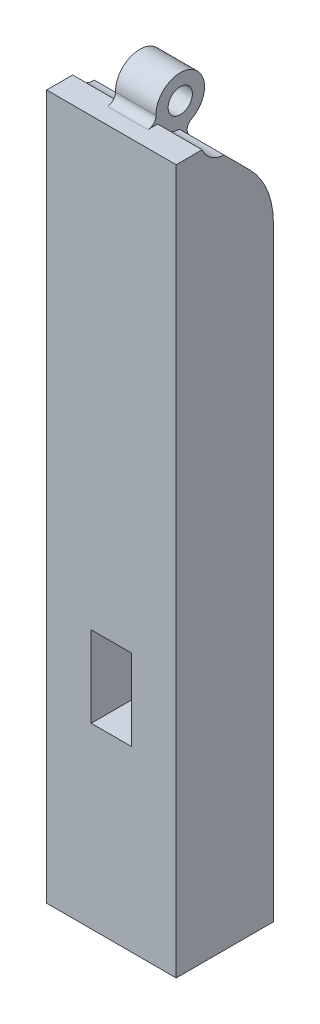
ISO-10303-21;
HEADER;
FILE_DESCRIPTION(('STEP AP214'),'2;1');
FILE_NAME('part.step','',(''),(''),'','','');
FILE_SCHEMA(('AUTOMOTIVE_DESIGN { 1 0 10303 214 1 1 1 1 }'));
ENDSEC;
DATA;
#1=APPLICATION_CONTEXT('core data for automotive mechanical design processes');
#2=APPLICATION_PROTOCOL_DEFINITION('international standard','automotive_design',2000,#1);
#3=PRODUCT_CONTEXT('',#1,'mechanical');
#4=PRODUCT('Part','Part','',(#3));
#5=PRODUCT_RELATED_PRODUCT_CATEGORY('part','',(#4));
#6=PRODUCT_DEFINITION_FORMATION('','',#4);
#7=PRODUCT_DEFINITION_CONTEXT('part definition',#1,'design');
#8=PRODUCT_DEFINITION('design','',#6,#7);
#9=PRODUCT_DEFINITION_SHAPE('','',#8);
#10=(LENGTH_UNIT() NAMED_UNIT(*) SI_UNIT(.MILLI.,.METRE.));
#11=(NAMED_UNIT(*) PLANE_ANGLE_UNIT() SI_UNIT($,.RADIAN.));
#12=(NAMED_UNIT(*) SI_UNIT($,.STERADIAN.) SOLID_ANGLE_UNIT());
#13=UNCERTAINTY_MEASURE_WITH_UNIT(LENGTH_MEASURE(1.E-05),#10,'distance_accuracy_value','');
#14=(GEOMETRIC_REPRESENTATION_CONTEXT(3) GLOBAL_UNCERTAINTY_ASSIGNED_CONTEXT((#13)) GLOBAL_UNIT_ASSIGNED_CONTEXT((#10,
#11,#12)) REPRESENTATION_CONTEXT('',''));
#15=CARTESIAN_POINT('',(0.,0.,0.));
#16=DIRECTION('',(0.,0.,1.));
#17=DIRECTION('',(1.,0.,0.));
#18=AXIS2_PLACEMENT_3D('',#15,#16,#17);
#19=CARTESIAN_POINT('',(0.,0.,0.));
#20=DIRECTION('',(0.,0.,1.));
#21=DIRECTION('',(1.,0.,0.));
#22=AXIS2_PLACEMENT_3D('',#19,#20,#21);
#23=PLANE('',#22);
#24=DIRECTION('',(0.,1.,0.));
#25=VECTOR('',#24,1.);
#26=CARTESIAN_POINT('',(-2.49999999999997,0.,0.));
#27=LINE('',#26,#25);
#28=CARTESIAN_POINT('',(-2.49999999999998,-21.0917859119298,0.));
#29=VERTEX_POINT('',#28);
#30=CARTESIAN_POINT('',(-2.49999999999997,-11.0917859119298,0.));
#31=VERTEX_POINT('',#30);
#32=EDGE_CURVE('E264',#29,#31,#27,.T.);
#33=ORIENTED_EDGE('',*,*,#32,.F.);
#34=DIRECTION('',(-1.,0.,0.));
#35=VECTOR('',#34,1.);
#36=CARTESIAN_POINT('',(0.,-21.0917859119298,0.));
#37=LINE('',#36,#35);
#38=CARTESIAN_POINT('',(2.50000000000002,-21.0917859119298,0.));
#39=VERTEX_POINT('',#38);
#40=EDGE_CURVE('E261',#39,#29,#37,.T.);
#41=ORIENTED_EDGE('',*,*,#40,.F.);
#42=DIRECTION('',(0.,1.,0.));
#43=VECTOR('',#42,1.);
#44=CARTESIAN_POINT('',(2.50000000000002,0.,0.));
#45=LINE('',#44,#43);
#46=CARTESIAN_POINT('',(2.50000000000002,-11.0917859119298,0.));
#47=VERTEX_POINT('',#46);
#48=EDGE_CURVE('E254',#39,#47,#45,.T.);
#49=ORIENTED_EDGE('',*,*,#48,.T.);
#50=DIRECTION('',(-1.,0.,0.));
#51=VECTOR('',#50,1.);
#52=CARTESIAN_POINT('',(0.,-11.0917859119298,0.));
#53=LINE('',#52,#51);
#54=EDGE_CURVE('E267',#47,#31,#53,.T.);
#55=ORIENTED_EDGE('',*,*,#54,.T.);
#56=EDGE_LOOP('',(#33,#41,#49,#55));
#57=FACE_BOUND('',#56,.T.);
#58=DIRECTION('',(0.,-1.,0.));
#59=VECTOR('',#58,1.);
#60=CARTESIAN_POINT('',(-8.,23.9082140880702,0.));
#61=LINE('',#60,#59);
#62=CARTESIAN_POINT('',(-8.,11.7660784643393,0.));
#63=VERTEX_POINT('',#62);
#64=CARTESIAN_POINT('',(-7.99999999999999,-63.0917859119298,0.));
#65=VERTEX_POINT('',#64);
#66=EDGE_CURVE('E343',#63,#65,#61,.T.);
#67=ORIENTED_EDGE('',*,*,#66,.F.);
#68=DIRECTION('',(1.,0.,0.));
#69=VECTOR('',#68,1.);
#70=CARTESIAN_POINT('',(0.,11.7660784643393,0.));
#71=LINE('',#70,#69);
#72=CARTESIAN_POINT('',(8.,11.7660784643393,0.));
#73=VERTEX_POINT('',#72);
#74=EDGE_CURVE('E427',#63,#73,#71,.T.);
#75=ORIENTED_EDGE('',*,*,#74,.T.);
#76=DIRECTION('',(0.,1.,0.));
#77=VECTOR('',#76,1.);
#78=CARTESIAN_POINT('',(8.,23.9082140880702,0.));
#79=LINE('',#78,#77);
#80=CARTESIAN_POINT('',(8.00000000000002,-63.0917859119298,0.));
#81=VERTEX_POINT('',#80);
#82=EDGE_CURVE('E349',#81,#73,#79,.T.);
#83=ORIENTED_EDGE('',*,*,#82,.F.);
#84=DIRECTION('',(1.,0.,0.));
#85=VECTOR('',#84,1.);
#86=CARTESIAN_POINT('',(-7.99999999999999,-63.0917859119298,0.));
#87=LINE('',#86,#85);
#88=EDGE_CURVE('E361',#65,#81,#87,.T.);
#89=ORIENTED_EDGE('',*,*,#88,.F.);
#90=EDGE_LOOP('',(#67,#75,#83,#89));
#91=FACE_BOUND('',#90,.T.);
#92=DIRECTION('',(0.,-1.,0.));
#93=VECTOR('',#92,1.);
#94=CARTESIAN_POINT('',(-2.49999999999997,0.,0.));
#95=LINE('',#94,#93);
#96=CARTESIAN_POINT('',(-2.49999999999998,-31.0917859119298,0.));
#97=VERTEX_POINT('',#96);
#98=CARTESIAN_POINT('',(-2.49999999999998,-41.0917859119298,0.));
#99=VERTEX_POINT('',#98);
#100=EDGE_CURVE('E243',#97,#99,#95,.T.);
#101=ORIENTED_EDGE('',*,*,#100,.T.);
#102=DIRECTION('',(-1.,0.,0.));
#103=VECTOR('',#102,1.);
#104=CARTESIAN_POINT('',(0.,-41.0917859119298,0.));
#105=LINE('',#104,#103);
#106=CARTESIAN_POINT('',(2.50000000000002,-41.0917859119298,0.));
#107=VERTEX_POINT('',#106);
#108=EDGE_CURVE('E295',#107,#99,#105,.T.);
#109=ORIENTED_EDGE('',*,*,#108,.F.);
#110=DIRECTION('',(0.,-1.,0.));
#111=VECTOR('',#110,1.);
#112=CARTESIAN_POINT('',(2.50000000000002,0.,0.));
#113=LINE('',#112,#111);
#114=CARTESIAN_POINT('',(2.50000000000002,-31.0917859119298,0.));
#115=VERTEX_POINT('',#114);
#116=EDGE_CURVE('E202',#115,#107,#113,.T.);
#117=ORIENTED_EDGE('',*,*,#116,.F.);
#118=DIRECTION('',(-1.,0.,0.));
#119=VECTOR('',#118,1.);
#120=CARTESIAN_POINT('',(0.,-31.0917859119298,0.));
#121=LINE('',#120,#119);
#122=EDGE_CURVE('E289',#115,#97,#121,.T.);
#123=ORIENTED_EDGE('',*,*,#122,.T.);
#124=EDGE_LOOP('',(#101,#109,#117,#123));
#125=FACE_BOUND('',#124,.T.);
#126=ADVANCED_FACE('F38',(#57,#91,#125),#23,.F.);
#127=CARTESIAN_POINT('',(-8.,25.0082140880702,6.));
#128=DIRECTION('',(1.,0.,0.));
#129=DIRECTION('',(0.,0.,-1.));
#130=AXIS2_PLACEMENT_3D('',#127,#128,#129);
#131=CYLINDRICAL_SURFACE('',#130,3.);
#132=CARTESIAN_POINT('',(-2.5,25.0082140880702,6.));
#133=DIRECTION('',(1.,0.,0.));
#134=DIRECTION('',(0.,0.,-1.));
#135=AXIS2_PLACEMENT_3D('',#132,#133,#134);
#136=CIRCLE('',#135,3.);
#137=CARTESIAN_POINT('',(-2.5,23.9082140880702,8.79105714739057));
#138=VERTEX_POINT('',#137);
#139=CARTESIAN_POINT('',(-2.5,22.0099392522742,6.10172516420398));
#140=VERTEX_POINT('',#139);
#141=EDGE_CURVE('E319',#138,#140,#136,.T.);
#142=ORIENTED_EDGE('',*,*,#141,.T.);
#143=DIRECTION('',(1.,0.,0.));
#144=VECTOR('',#143,1.);
#145=CARTESIAN_POINT('',(-8.,22.0099392522742,6.10172516420398));
#146=LINE('',#145,#144);
#147=CARTESIAN_POINT('',(-8.,22.0099392522742,6.10172516420398));
#148=VERTEX_POINT('',#147);
#149=EDGE_CURVE('E383',#148,#140,#146,.T.);
#150=ORIENTED_EDGE('',*,*,#149,.F.);
#151=CARTESIAN_POINT('',(-8.,25.0082140880702,6.));
#152=DIRECTION('',(1.,0.,0.));
#153=DIRECTION('',(0.,0.,-1.));
#154=AXIS2_PLACEMENT_3D('',#151,#152,#153);
#155=CIRCLE('',#154,3.);
#156=CARTESIAN_POINT('',(-8.,23.9082140880702,8.79105714739057));
#157=VERTEX_POINT('',#156);
#158=EDGE_CURVE('E326',#157,#148,#155,.T.);
#159=ORIENTED_EDGE('',*,*,#158,.F.);
#160=DIRECTION('',(1.,0.,0.));
#161=VECTOR('',#160,1.);
#162=CARTESIAN_POINT('',(-8.,23.9082140880702,8.79105714739057));
#163=LINE('',#162,#161);
#164=EDGE_CURVE('E330',#138,#157,#163,.F.);
#165=ORIENTED_EDGE('',*,*,#164,.F.);
#166=EDGE_LOOP('',(#142,#150,#159,#165));
#167=FACE_BOUND('',#166,.T.);
#168=ADVANCED_FACE('F468',(#167),#131,.F.);
#169=CARTESIAN_POINT('',(-8.,23.9082140880702,12.));
#170=DIRECTION('',(1.,0.,0.));
#171=DIRECTION('',(0.,1.,0.));
#172=AXIS2_PLACEMENT_3D('',#169,#170,#171);
#173=PLANE('',#172);
#174=DIRECTION('',(0.,-0.707106781186547,-0.707106781186548));
#175=VECTOR('',#174,1.);
#176=CARTESIAN_POINT('',(-8.,7.95410704403511,-7.9541070440351));
#177=LINE('',#176,#175);
#178=CARTESIAN_POINT('',(-8.,18.8371462762047,2.92893218813453));
#179=VERTEX_POINT('',#178);
#180=EDGE_CURVE('E339',#148,#179,#177,.T.);
#181=ORIENTED_EDGE('',*,*,#180,.T.);
#182=CARTESIAN_POINT('',(-8.,11.7660784643393,10.));
#183=DIRECTION('',(1.,0.,0.));
#184=DIRECTION('',(0.,1.,0.));
#185=AXIS2_PLACEMENT_3D('',#182,#183,#184);
#186=CIRCLE('',#185,10.);
#187=EDGE_CURVE('E11',#179,#63,#186,.F.);
#188=ORIENTED_EDGE('',*,*,#187,.T.);
#189=ORIENTED_EDGE('',*,*,#66,.T.);
#190=DIRECTION('',(0.,0.,-1.));
#191=VECTOR('',#190,1.);
#192=CARTESIAN_POINT('',(-7.99999999999999,-63.0917859119298,12.));
#193=LINE('',#192,#191);
#194=CARTESIAN_POINT('',(-7.99999999999999,-63.0917859119298,12.));
#195=VERTEX_POINT('',#194);
#196=EDGE_CURVE('E378',#195,#65,#193,.T.);
#197=ORIENTED_EDGE('',*,*,#196,.F.);
#198=DIRECTION('',(0.,-1.,0.));
#199=VECTOR('',#198,1.);
#200=CARTESIAN_POINT('',(-8.,23.9082140880702,12.));
#201=LINE('',#200,#199);
#202=CARTESIAN_POINT('',(-8.,23.9082140880702,12.));
#203=VERTEX_POINT('',#202);
#204=EDGE_CURVE('E344',#203,#195,#201,.T.);
#205=ORIENTED_EDGE('',*,*,#204,.F.);
#206=DIRECTION('',(0.,0.,-1.));
#207=VECTOR('',#206,1.);
#208=CARTESIAN_POINT('',(-8.,23.9082140880702,12.));
#209=LINE('',#208,#207);
#210=EDGE_CURVE('E358',#203,#157,#209,.T.);
#211=ORIENTED_EDGE('',*,*,#210,.T.);
#212=ORIENTED_EDGE('',*,*,#158,.T.);
#213=EDGE_LOOP('',(#181,#188,#189,#197,#205,#211,#212));
#214=FACE_BOUND('',#213,.T.);
#215=ADVANCED_FACE('F442',(#214),#173,.F.);
#216=CARTESIAN_POINT('',(-7.99999999999999,-63.0917859119298,12.));
#217=DIRECTION('',(0.,1.,0.));
#218=DIRECTION('',(0.,0.,1.));
#219=AXIS2_PLACEMENT_3D('',#216,#217,#218);
#220=PLANE('',#219);
#221=ORIENTED_EDGE('',*,*,#88,.T.);
#222=DIRECTION('',(0.,0.,-1.));
#223=VECTOR('',#222,1.);
#224=CARTESIAN_POINT('',(8.00000000000002,-63.0917859119298,12.));
#225=LINE('',#224,#223);
#226=CARTESIAN_POINT('',(8.00000000000002,-63.0917859119298,12.));
#227=VERTEX_POINT('',#226);
#228=EDGE_CURVE('E374',#227,#81,#225,.T.);
#229=ORIENTED_EDGE('',*,*,#228,.F.);
#230=DIRECTION('',(1.,0.,0.));
#231=VECTOR('',#230,1.);
#232=CARTESIAN_POINT('',(-7.99999999999999,-63.0917859119298,12.));
#233=LINE('',#232,#231);
#234=EDGE_CURVE('E348',#195,#227,#233,.T.);
#235=ORIENTED_EDGE('',*,*,#234,.F.);
#236=ORIENTED_EDGE('',*,*,#196,.T.);
#237=EDGE_LOOP('',(#221,#229,#235,#236));
#238=FACE_BOUND('',#237,.T.);
#239=ADVANCED_FACE('F456',(#238),#220,.F.);
#240=CARTESIAN_POINT('',(8.,23.9082140880702,12.));
#241=DIRECTION('',(-1.,0.,0.));
#242=DIRECTION('',(0.,-1.,0.));
#243=AXIS2_PLACEMENT_3D('',#240,#241,#242);
#244=PLANE('',#243);
#245=ORIENTED_EDGE('',*,*,#82,.T.);
#246=CARTESIAN_POINT('',(8.,11.7660784643393,10.));
#247=DIRECTION('',(-1.,0.,0.));
#248=DIRECTION('',(0.,-1.,0.));
#249=AXIS2_PLACEMENT_3D('',#246,#247,#248);
#250=CIRCLE('',#249,10.);
#251=CARTESIAN_POINT('',(8.00000000000002,18.8371462762047,2.92893218813453));
#252=VERTEX_POINT('',#251);
#253=EDGE_CURVE('E431',#73,#252,#250,.F.);
#254=ORIENTED_EDGE('',*,*,#253,.T.);
#255=DIRECTION('',(0.,-0.707106781186547,-0.707106781186548));
#256=VECTOR('',#255,1.);
#257=CARTESIAN_POINT('',(8.00000000000002,7.95410704403511,-7.9541070440351));
#258=LINE('',#257,#256);
#259=CARTESIAN_POINT('',(8.00000000000002,22.0099392522742,6.10172516420398));
#260=VERTEX_POINT('',#259);
#261=EDGE_CURVE('E335',#260,#252,#258,.T.);
#262=ORIENTED_EDGE('',*,*,#261,.F.);
#263=CARTESIAN_POINT('',(8.00000000000002,25.0082140880702,6.));
#264=DIRECTION('',(1.,0.,0.));
#265=DIRECTION('',(0.,0.,-1.));
#266=AXIS2_PLACEMENT_3D('',#263,#264,#265);
#267=CIRCLE('',#266,3.);
#268=CARTESIAN_POINT('',(8.00000000000002,23.9082140880702,8.79105714739057));
#269=VERTEX_POINT('',#268);
#270=EDGE_CURVE('E317',#269,#260,#267,.T.);
#271=ORIENTED_EDGE('',*,*,#270,.F.);
#272=DIRECTION('',(0.,0.,-1.));
#273=VECTOR('',#272,1.);
#274=CARTESIAN_POINT('',(8.,23.9082140880702,12.));
#275=LINE('',#274,#273);
#276=CARTESIAN_POINT('',(8.,23.9082140880702,12.));
#277=VERTEX_POINT('',#276);
#278=EDGE_CURVE('E370',#277,#269,#275,.T.);
#279=ORIENTED_EDGE('',*,*,#278,.F.);
#280=DIRECTION('',(0.,1.,0.));
#281=VECTOR('',#280,1.);
#282=CARTESIAN_POINT('',(8.,23.9082140880702,12.));
#283=LINE('',#282,#281);
#284=EDGE_CURVE('E352',#227,#277,#283,.T.);
#285=ORIENTED_EDGE('',*,*,#284,.F.);
#286=ORIENTED_EDGE('',*,*,#228,.T.);
#287=EDGE_LOOP('',(#245,#254,#262,#271,#279,#285,#286));
#288=FACE_BOUND('',#287,.T.);
#289=ADVANCED_FACE('F451',(#288),#244,.F.);
#290=CARTESIAN_POINT('',(-8.,23.9082140880702,12.));
#291=DIRECTION('',(0.,-1.,0.));
#292=DIRECTION('',(1.,0.,0.));
#293=AXIS2_PLACEMENT_3D('',#290,#291,#292);
#294=PLANE('',#293);
#295=DIRECTION('',(1.,0.,0.));
#296=VECTOR('',#295,1.);
#297=CARTESIAN_POINT('',(-2.5,23.9082140880702,9.99874980462644));
#298=LINE('',#297,#296);
#299=CARTESIAN_POINT('',(2.5,23.9082140880702,9.99874980462644));
#300=VERTEX_POINT('',#299);
#301=CARTESIAN_POINT('',(-2.5,23.9082140880702,9.99874980462644));
#302=VERTEX_POINT('',#301);
#303=EDGE_CURVE('E391',#300,#302,#298,.F.);
#304=ORIENTED_EDGE('',*,*,#303,.T.);
#305=DIRECTION('',(0.,0.,-1.));
#306=VECTOR('',#305,1.);
#307=CARTESIAN_POINT('',(-2.5,23.9082140880702,6.));
#308=LINE('',#307,#306);
#309=EDGE_CURVE('E395',#302,#138,#308,.T.);
#310=ORIENTED_EDGE('',*,*,#309,.T.);
#311=ORIENTED_EDGE('',*,*,#164,.T.);
#312=ORIENTED_EDGE('',*,*,#210,.F.);
#313=DIRECTION('',(-1.,0.,0.));
#314=VECTOR('',#313,1.);
#315=CARTESIAN_POINT('',(-8.,23.9082140880702,12.));
#316=LINE('',#315,#314);
#317=EDGE_CURVE('E355',#277,#203,#316,.T.);
#318=ORIENTED_EDGE('',*,*,#317,.F.);
#319=ORIENTED_EDGE('',*,*,#278,.T.);
#320=CARTESIAN_POINT('',(2.5,23.9082140880702,8.79105714739057));
#321=VERTEX_POINT('',#320);
#322=EDGE_CURVE('E331',#269,#321,#163,.F.);
#323=ORIENTED_EDGE('',*,*,#322,.T.);
#324=DIRECTION('',(0.,0.,1.));
#325=VECTOR('',#324,1.);
#326=CARTESIAN_POINT('',(2.5,23.9082140880702,12.));
#327=LINE('',#326,#325);
#328=EDGE_CURVE('E387',#321,#300,#327,.T.);
#329=ORIENTED_EDGE('',*,*,#328,.T.);
#330=EDGE_LOOP('',(#304,#310,#311,#312,#318,#319,#323,#329));
#331=FACE_BOUND('',#330,.T.);
#332=ADVANCED_FACE('F462',(#331),#294,.F.);
#333=CARTESIAN_POINT('',(0.,0.,12.));
#334=DIRECTION('',(0.,0.,1.));
#335=DIRECTION('',(1.,0.,0.));
#336=AXIS2_PLACEMENT_3D('',#333,#334,#335);
#337=PLANE('',#336);
#338=DIRECTION('',(0.,-1.,0.));
#339=VECTOR('',#338,1.);
#340=CARTESIAN_POINT('',(2.50000000000002,-31.0917859119298,12.));
#341=LINE('',#340,#339);
#342=CARTESIAN_POINT('',(2.50000000000002,-31.0917859119298,12.));
#343=VERTEX_POINT('',#342);
#344=CARTESIAN_POINT('',(2.50000000000002,-41.0917859119298,12.));
#345=VERTEX_POINT('',#344);
#346=EDGE_CURVE('E199',#343,#345,#341,.T.);
#347=ORIENTED_EDGE('',*,*,#346,.T.);
#348=DIRECTION('',(-1.,0.,0.));
#349=VECTOR('',#348,1.);
#350=CARTESIAN_POINT('',(2.50000000000002,-41.0917859119298,12.));
#351=LINE('',#350,#349);
#352=CARTESIAN_POINT('',(-2.49999999999998,-41.0917859119298,12.));
#353=VERTEX_POINT('',#352);
#354=EDGE_CURVE('E208',#345,#353,#351,.T.);
#355=ORIENTED_EDGE('',*,*,#354,.T.);
#356=DIRECTION('',(0.,1.,0.));
#357=VECTOR('',#356,1.);
#358=CARTESIAN_POINT('',(-2.49999999999998,-31.0917859119298,12.));
#359=LINE('',#358,#357);
#360=CARTESIAN_POINT('',(-2.49999999999998,-31.0917859119298,12.));
#361=VERTEX_POINT('',#360);
#362=EDGE_CURVE('E213',#353,#361,#359,.T.);
#363=ORIENTED_EDGE('',*,*,#362,.T.);
#364=DIRECTION('',(1.,0.,0.));
#365=VECTOR('',#364,1.);
#366=CARTESIAN_POINT('',(2.50000000000002,-31.0917859119298,12.));
#367=LINE('',#366,#365);
#368=EDGE_CURVE('E218',#361,#343,#367,.T.);
#369=ORIENTED_EDGE('',*,*,#368,.T.);
#370=EDGE_LOOP('',(#347,#355,#363,#369));
#371=FACE_BOUND('',#370,.T.);
#372=ORIENTED_EDGE('',*,*,#204,.T.);
#373=ORIENTED_EDGE('',*,*,#234,.T.);
#374=ORIENTED_EDGE('',*,*,#284,.T.);
#375=ORIENTED_EDGE('',*,*,#317,.T.);
#376=EDGE_LOOP('',(#372,#373,#374,#375));
#377=FACE_BOUND('',#376,.T.);
#378=ADVANCED_FACE('F215',(#371,#377),#337,.T.);
#379=CARTESIAN_POINT('',(-8.,7.95410704403511,-7.9541070440351));
#380=DIRECTION('',(0.,-0.707106781186548,0.707106781186547));
#381=DIRECTION('',(0.,-0.707106781186547,-0.707106781186548));
#382=AXIS2_PLACEMENT_3D('',#379,#380,#381);
#383=PLANE('',#382);
#384=ORIENTED_EDGE('',*,*,#261,.T.);
#385=DIRECTION('',(1.,0.,0.));
#386=VECTOR('',#385,1.);
#387=CARTESIAN_POINT('',(-8.,18.8371462762047,2.92893218813453));
#388=LINE('',#387,#386);
#389=EDGE_CURVE('E47',#252,#179,#388,.F.);
#390=ORIENTED_EDGE('',*,*,#389,.T.);
#391=ORIENTED_EDGE('',*,*,#180,.F.);
#392=ORIENTED_EDGE('',*,*,#149,.T.);
#393=DIRECTION('',(0.,-0.707106781186547,-0.707106781186548));
#394=VECTOR('',#393,1.);
#395=CARTESIAN_POINT('',(-2.5,23.4582140880702,7.55));
#396=LINE('',#395,#394);
#397=CARTESIAN_POINT('',(-2.5,20.7583009373044,4.85008684923416));
#398=VERTEX_POINT('',#397);
#399=EDGE_CURVE('E404',#140,#398,#396,.T.);
#400=ORIENTED_EDGE('',*,*,#399,.T.);
#401=DIRECTION('',(1.,0.,0.));
#402=VECTOR('',#401,1.);
#403=CARTESIAN_POINT('',(2.5,20.7583009373044,4.85008684923417));
#404=LINE('',#403,#402);
#405=CARTESIAN_POINT('',(2.5,20.7583009373044,4.85008684923416));
#406=VERTEX_POINT('',#405);
#407=EDGE_CURVE('E408',#398,#406,#404,.T.);
#408=ORIENTED_EDGE('',*,*,#407,.T.);
#409=DIRECTION('',(0.,0.707106781186547,0.707106781186548));
#410=VECTOR('',#409,1.);
#411=CARTESIAN_POINT('',(2.5,7.95410704403511,-7.9541070440351));
#412=LINE('',#411,#410);
#413=CARTESIAN_POINT('',(2.5,22.0099392522742,6.10172516420398));
#414=VERTEX_POINT('',#413);
#415=EDGE_CURVE('E412',#406,#414,#412,.T.);
#416=ORIENTED_EDGE('',*,*,#415,.T.);
#417=EDGE_CURVE('E382',#414,#260,#146,.T.);
#418=ORIENTED_EDGE('',*,*,#417,.T.);
#419=EDGE_LOOP('',(#384,#390,#391,#392,#400,#408,#416,#418));
#420=FACE_BOUND('',#419,.T.);
#421=ADVANCED_FACE('F437',(#420),#383,.F.);
#422=ORIENTED_EDGE('',*,*,#417,.F.);
#423=CARTESIAN_POINT('',(2.5,25.0082140880702,6.));
#424=DIRECTION('',(1.,0.,0.));
#425=DIRECTION('',(0.,0.,-1.));
#426=AXIS2_PLACEMENT_3D('',#423,#424,#425);
#427=CIRCLE('',#426,3.);
#428=EDGE_CURVE('E313',#321,#414,#427,.T.);
#429=ORIENTED_EDGE('',*,*,#428,.F.);
#430=ORIENTED_EDGE('',*,*,#322,.F.);
#431=ORIENTED_EDGE('',*,*,#270,.T.);
#432=EDGE_LOOP('',(#422,#429,#430,#431));
#433=FACE_BOUND('',#432,.T.);
#434=ADVANCED_FACE('F484',(#433),#131,.F.);
#435=CARTESIAN_POINT('',(2.5,25.0082140880702,6.));
#436=DIRECTION('',(-1.,0.,0.));
#437=DIRECTION('',(0.,0.,1.));
#438=AXIS2_PLACEMENT_3D('',#435,#436,#437);
#439=CYLINDRICAL_SURFACE('',#438,3.);
#440=CARTESIAN_POINT('',(-2.5,22.3511093108857,4.60723505103571));
#441=VERTEX_POINT('',#440);
#442=CARTESIAN_POINT('',(-2.5,24.9332140880702,8.99906235346983));
#443=VERTEX_POINT('',#442);
#444=EDGE_CURVE('E309',#441,#443,#136,.T.);
#445=ORIENTED_EDGE('',*,*,#444,.T.);
#446=DIRECTION('',(-1.,0.,0.));
#447=VECTOR('',#446,1.);
#448=CARTESIAN_POINT('',(2.5,24.9332140880702,8.99906235346983));
#449=LINE('',#448,#447);
#450=CARTESIAN_POINT('',(2.5,24.9332140880702,8.99906235346983));
#451=VERTEX_POINT('',#450);
#452=EDGE_CURVE('E401',#443,#451,#449,.F.);
#453=ORIENTED_EDGE('',*,*,#452,.T.);
#454=CARTESIAN_POINT('',(2.5,22.3511093108857,4.60723505103571));
#455=VERTEX_POINT('',#454);
#456=EDGE_CURVE('E318',#455,#451,#427,.T.);
#457=ORIENTED_EDGE('',*,*,#456,.F.);
#458=DIRECTION('',(-1.,0.,0.));
#459=VECTOR('',#458,1.);
#460=CARTESIAN_POINT('',(2.5,22.3511093108857,4.60723505103571));
#461=LINE('',#460,#459);
#462=EDGE_CURVE('E398',#455,#441,#461,.T.);
#463=ORIENTED_EDGE('',*,*,#462,.T.);
#464=EDGE_LOOP('',(#445,#453,#457,#463));
#465=FACE_BOUND('',#464,.T.);
#466=ADVANCED_FACE('F493',(#465),#439,.T.);
#467=CARTESIAN_POINT('',(2.5,25.0082140880702,6.));
#468=DIRECTION('',(1.,0.,0.));
#469=DIRECTION('',(0.,0.,-1.));
#470=AXIS2_PLACEMENT_3D('',#467,#468,#469);
#471=PLANE('',#470);
#472=ORIENTED_EDGE('',*,*,#428,.T.);
#473=ORIENTED_EDGE('',*,*,#415,.F.);
#474=CARTESIAN_POINT('',(2.5,21.4654077184909,4.14298006804762));
#475=DIRECTION('',(1.,0.,0.));
#476=DIRECTION('',(0.,0.,-1.));
#477=AXIS2_PLACEMENT_3D('',#474,#475,#476);
#478=CIRCLE('',#477,1.);
#479=EDGE_CURVE('E421',#406,#455,#478,.F.);
#480=ORIENTED_EDGE('',*,*,#479,.T.);
#481=ORIENTED_EDGE('',*,*,#456,.T.);
#482=CARTESIAN_POINT('',(2.5,24.9082140880702,9.99874980462644));
#483=DIRECTION('',(1.,0.,0.));
#484=DIRECTION('',(0.,0.,-1.));
#485=AXIS2_PLACEMENT_3D('',#482,#483,#484);
#486=CIRCLE('',#485,1.);
#487=EDGE_CURVE('E418',#451,#300,#486,.F.);
#488=ORIENTED_EDGE('',*,*,#487,.T.);
#489=ORIENTED_EDGE('',*,*,#328,.F.);
#490=EDGE_LOOP('',(#472,#473,#480,#481,#488,#489));
#491=FACE_BOUND('',#490,.T.);
#492=CARTESIAN_POINT('',(2.5,25.0082140880702,6.));
#493=DIRECTION('',(1.,0.,0.));
#494=DIRECTION('',(0.,0.,-1.));
#495=AXIS2_PLACEMENT_3D('',#492,#493,#494);
#496=CIRCLE('',#495,1.5);
#497=CARTESIAN_POINT('',(2.5,25.0082140880702,4.5));
#498=VERTEX_POINT('',#497);
#499=EDGE_CURVE('E305',#498,#498,#496,.T.);
#500=ORIENTED_EDGE('',*,*,#499,.F.);
#501=EDGE_LOOP('',(#500));
#502=FACE_BOUND('',#501,.T.);
#503=ADVANCED_FACE('F479',(#491,#502),#471,.T.);
#504=CARTESIAN_POINT('',(-2.5,25.0082140880702,6.));
#505=DIRECTION('',(1.,0.,0.));
#506=DIRECTION('',(0.,0.,-1.));
#507=AXIS2_PLACEMENT_3D('',#504,#505,#506);
#508=PLANE('',#507);
#509=ORIENTED_EDGE('',*,*,#141,.F.);
#510=ORIENTED_EDGE('',*,*,#309,.F.);
#511=CARTESIAN_POINT('',(-2.5,24.9082140880702,9.99874980462644));
#512=DIRECTION('',(1.,0.,0.));
#513=DIRECTION('',(0.,0.,-1.));
#514=AXIS2_PLACEMENT_3D('',#511,#512,#513);
#515=CIRCLE('',#514,1.);
#516=EDGE_CURVE('E415',#302,#443,#515,.T.);
#517=ORIENTED_EDGE('',*,*,#516,.T.);
#518=ORIENTED_EDGE('',*,*,#444,.F.);
#519=CARTESIAN_POINT('',(-2.5,21.4654077184909,4.14298006804762));
#520=DIRECTION('',(1.,0.,0.));
#521=DIRECTION('',(0.,0.,-1.));
#522=AXIS2_PLACEMENT_3D('',#519,#520,#521);
#523=CIRCLE('',#522,1.);
#524=EDGE_CURVE('E424',#441,#398,#523,.T.);
#525=ORIENTED_EDGE('',*,*,#524,.T.);
#526=ORIENTED_EDGE('',*,*,#399,.F.);
#527=EDGE_LOOP('',(#509,#510,#517,#518,#525,#526));
#528=FACE_BOUND('',#527,.T.);
#529=CARTESIAN_POINT('',(-2.5,25.0082140880702,6.));
#530=DIRECTION('',(1.,0.,0.));
#531=DIRECTION('',(0.,0.,-1.));
#532=AXIS2_PLACEMENT_3D('',#529,#530,#531);
#533=CIRCLE('',#532,1.5);
#534=CARTESIAN_POINT('',(-2.5,25.0082140880702,4.5));
#535=VERTEX_POINT('',#534);
#536=EDGE_CURVE('E277',#535,#535,#533,.T.);
#537=ORIENTED_EDGE('',*,*,#536,.T.);
#538=EDGE_LOOP('',(#537));
#539=FACE_BOUND('',#538,.T.);
#540=ADVANCED_FACE('F498',(#528,#539),#508,.F.);
#541=CARTESIAN_POINT('',(2.5,25.0082140880702,6.));
#542=DIRECTION('',(-1.,0.,0.));
#543=DIRECTION('',(0.,0.,1.));
#544=AXIS2_PLACEMENT_3D('',#541,#542,#543);
#545=CYLINDRICAL_SURFACE('',#544,1.5);
#546=ORIENTED_EDGE('',*,*,#499,.T.);
#547=EDGE_LOOP('',(#546));
#548=FACE_BOUND('',#547,.T.);
#549=ORIENTED_EDGE('',*,*,#536,.F.);
#550=EDGE_LOOP('',(#549));
#551=FACE_BOUND('',#550,.T.);
#552=ADVANCED_FACE('F501',(#548,#551),#545,.F.);
#553=CARTESIAN_POINT('',(2.5,24.9082140880702,9.99874980462644));
#554=DIRECTION('',(-1.,0.,0.));
#555=DIRECTION('',(0.,0.,1.));
#556=AXIS2_PLACEMENT_3D('',#553,#554,#555);
#557=CYLINDRICAL_SURFACE('',#556,1.);
#558=ORIENTED_EDGE('',*,*,#487,.F.);
#559=ORIENTED_EDGE('',*,*,#452,.F.);
#560=ORIENTED_EDGE('',*,*,#516,.F.);
#561=ORIENTED_EDGE('',*,*,#303,.F.);
#562=EDGE_LOOP('',(#558,#559,#560,#561));
#563=FACE_BOUND('',#562,.T.);
#564=ADVANCED_FACE('F496',(#563),#557,.F.);
#565=CARTESIAN_POINT('',(2.5,21.4654077184909,4.14298006804762));
#566=DIRECTION('',(-1.,0.,0.));
#567=DIRECTION('',(0.,0.,1.));
#568=AXIS2_PLACEMENT_3D('',#565,#566,#567);
#569=CYLINDRICAL_SURFACE('',#568,1.);
#570=ORIENTED_EDGE('',*,*,#524,.F.);
#571=ORIENTED_EDGE('',*,*,#462,.F.);
#572=ORIENTED_EDGE('',*,*,#479,.F.);
#573=ORIENTED_EDGE('',*,*,#407,.F.);
#574=EDGE_LOOP('',(#570,#571,#572,#573));
#575=FACE_BOUND('',#574,.T.);
#576=ADVANCED_FACE('F473',(#575),#569,.F.);
#577=CARTESIAN_POINT('',(0.,11.7660784643393,10.));
#578=DIRECTION('',(1.,0.,0.));
#579=DIRECTION('',(0.,0.,-1.));
#580=AXIS2_PLACEMENT_3D('',#577,#578,#579);
#581=CYLINDRICAL_SURFACE('',#580,10.);
#582=ORIENTED_EDGE('',*,*,#187,.F.);
#583=ORIENTED_EDGE('',*,*,#389,.F.);
#584=ORIENTED_EDGE('',*,*,#253,.F.);
#585=ORIENTED_EDGE('',*,*,#74,.F.);
#586=EDGE_LOOP('',(#582,#583,#584,#585));
#587=FACE_BOUND('',#586,.T.);
#588=ADVANCED_FACE('F40',(#587),#581,.T.);
#589=CARTESIAN_POINT('',(0.,-41.0917859119298,5.));
#590=DIRECTION('',(0.,-1.,0.));
#591=DIRECTION('',(0.,0.,-1.));
#592=AXIS2_PLACEMENT_3D('',#589,#590,#591);
#593=PLANE('',#592);
#594=ORIENTED_EDGE('',*,*,#108,.T.);
#595=DIRECTION('',(0.,0.,-1.));
#596=VECTOR('',#595,1.);
#597=CARTESIAN_POINT('',(-2.49999999999998,-41.0917859119298,5.));
#598=LINE('',#597,#596);
#599=EDGE_CURVE('E54',#353,#99,#598,.T.);
#600=ORIENTED_EDGE('',*,*,#599,.F.);
#601=ORIENTED_EDGE('',*,*,#354,.F.);
#602=DIRECTION('',(0.,0.,-1.));
#603=VECTOR('',#602,1.);
#604=CARTESIAN_POINT('',(2.50000000000002,-41.0917859119298,5.));
#605=LINE('',#604,#603);
#606=EDGE_CURVE('E195',#345,#107,#605,.T.);
#607=ORIENTED_EDGE('',*,*,#606,.T.);
#608=EDGE_LOOP('',(#594,#600,#601,#607));
#609=FACE_BOUND('',#608,.T.);
#610=ADVANCED_FACE('F209',(#609),#593,.F.);
#611=CARTESIAN_POINT('',(0.,-31.0917859119298,5.));
#612=DIRECTION('',(0.,-1.,0.));
#613=DIRECTION('',(0.,0.,-1.));
#614=AXIS2_PLACEMENT_3D('',#611,#612,#613);
#615=PLANE('',#614);
#616=DIRECTION('',(1.,0.,0.));
#617=VECTOR('',#616,1.);
#618=CARTESIAN_POINT('',(2.50000000000002,-31.0917859119298,2.5));
#619=LINE('',#618,#617);
#620=CARTESIAN_POINT('',(-2.49999999999998,-31.0917859119298,2.5));
#621=VERTEX_POINT('',#620);
#622=CARTESIAN_POINT('',(2.50000000000002,-31.0917859119298,2.5));
#623=VERTEX_POINT('',#622);
#624=EDGE_CURVE('E240',#621,#623,#619,.T.);
#625=ORIENTED_EDGE('',*,*,#624,.F.);
#626=DIRECTION('',(0.,0.,-1.));
#627=VECTOR('',#626,1.);
#628=CARTESIAN_POINT('',(-2.49999999999998,-31.0917859119298,5.));
#629=LINE('',#628,#627);
#630=EDGE_CURVE('E298',#621,#97,#629,.T.);
#631=ORIENTED_EDGE('',*,*,#630,.T.);
#632=ORIENTED_EDGE('',*,*,#122,.F.);
#633=DIRECTION('',(0.,0.,-1.));
#634=VECTOR('',#633,1.);
#635=CARTESIAN_POINT('',(2.50000000000002,-31.0917859119298,5.));
#636=LINE('',#635,#634);
#637=EDGE_CURVE('E205',#623,#115,#636,.T.);
#638=ORIENTED_EDGE('',*,*,#637,.F.);
#639=EDGE_LOOP('',(#625,#631,#632,#638));
#640=FACE_BOUND('',#639,.T.);
#641=ADVANCED_FACE('F541',(#640),#615,.T.);
#642=CARTESIAN_POINT('',(0.,-21.0917859119298,5.));
#643=DIRECTION('',(0.,-1.,0.));
#644=DIRECTION('',(0.,0.,-1.));
#645=AXIS2_PLACEMENT_3D('',#642,#643,#644);
#646=PLANE('',#645);
#647=DIRECTION('',(0.,0.,-1.));
#648=VECTOR('',#647,1.);
#649=CARTESIAN_POINT('',(-2.49999999999998,-21.0917859119298,5.));
#650=LINE('',#649,#648);
#651=CARTESIAN_POINT('',(-2.49999999999998,-21.0917859119298,2.5));
#652=VERTEX_POINT('',#651);
#653=EDGE_CURVE('E62',#652,#29,#650,.T.);
#654=ORIENTED_EDGE('',*,*,#653,.F.);
#655=DIRECTION('',(-1.,0.,0.));
#656=VECTOR('',#655,1.);
#657=CARTESIAN_POINT('',(2.50000000000002,-21.0917859119298,2.5));
#658=LINE('',#657,#656);
#659=CARTESIAN_POINT('',(2.50000000000002,-21.0917859119298,2.5));
#660=VERTEX_POINT('',#659);
#661=EDGE_CURVE('E235',#660,#652,#658,.T.);
#662=ORIENTED_EDGE('',*,*,#661,.F.);
#663=DIRECTION('',(0.,0.,-1.));
#664=VECTOR('',#663,1.);
#665=CARTESIAN_POINT('',(2.50000000000002,-21.0917859119298,5.));
#666=LINE('',#665,#664);
#667=EDGE_CURVE('E274',#660,#39,#666,.T.);
#668=ORIENTED_EDGE('',*,*,#667,.T.);
#669=ORIENTED_EDGE('',*,*,#40,.T.);
#670=EDGE_LOOP('',(#654,#662,#668,#669));
#671=FACE_BOUND('',#670,.T.);
#672=ADVANCED_FACE('F546',(#671),#646,.F.);
#673=CARTESIAN_POINT('',(2.50000000000002,0.,5.));
#674=DIRECTION('',(-1.,0.,0.));
#675=DIRECTION('',(0.,-1.,0.));
#676=AXIS2_PLACEMENT_3D('',#673,#674,#675);
#677=PLANE('',#676);
#678=DIRECTION('',(0.,-1.,0.));
#679=VECTOR('',#678,1.);
#680=CARTESIAN_POINT('',(2.50000000000002,28.0092140880702,2.5));
#681=LINE('',#680,#679);
#682=EDGE_CURVE('E239',#660,#623,#681,.T.);
#683=ORIENTED_EDGE('',*,*,#682,.T.);
#684=ORIENTED_EDGE('',*,*,#637,.T.);
#685=ORIENTED_EDGE('',*,*,#116,.T.);
#686=ORIENTED_EDGE('',*,*,#606,.F.);
#687=ORIENTED_EDGE('',*,*,#346,.F.);
#688=DIRECTION('',(0.,0.,-1.));
#689=VECTOR('',#688,1.);
#690=CARTESIAN_POINT('',(2.50000000000002,-31.0917859119298,12.));
#691=LINE('',#690,#689);
#692=CARTESIAN_POINT('',(2.50000000000002,-31.0917859119298,5.));
#693=VERTEX_POINT('',#692);
#694=EDGE_CURVE('E227',#343,#693,#691,.T.);
#695=ORIENTED_EDGE('',*,*,#694,.T.);
#696=DIRECTION('',(0.,1.,0.));
#697=VECTOR('',#696,1.);
#698=CARTESIAN_POINT('',(2.50000000000002,0.,5.));
#699=LINE('',#698,#697);
#700=CARTESIAN_POINT('',(2.50000000000002,-11.0917859119298,5.));
#701=VERTEX_POINT('',#700);
#702=EDGE_CURVE('E258',#693,#701,#699,.T.);
#703=ORIENTED_EDGE('',*,*,#702,.T.);
#704=DIRECTION('',(0.,0.,-1.));
#705=VECTOR('',#704,1.);
#706=CARTESIAN_POINT('',(2.50000000000002,-11.0917859119298,5.));
#707=LINE('',#706,#705);
#708=EDGE_CURVE('E278',#701,#47,#707,.T.);
#709=ORIENTED_EDGE('',*,*,#708,.T.);
#710=ORIENTED_EDGE('',*,*,#48,.F.);
#711=ORIENTED_EDGE('',*,*,#667,.F.);
#712=EDGE_LOOP('',(#683,#684,#685,#686,#687,#695,#703,#709,#710,#711));
#713=FACE_BOUND('',#712,.T.);
#714=ADVANCED_FACE('F196',(#713),#677,.T.);
#715=CARTESIAN_POINT('',(0.,-11.0917859119298,5.));
#716=DIRECTION('',(0.,-1.,0.));
#717=DIRECTION('',(0.,0.,-1.));
#718=AXIS2_PLACEMENT_3D('',#715,#716,#717);
#719=PLANE('',#718);
#720=ORIENTED_EDGE('',*,*,#54,.F.);
#721=ORIENTED_EDGE('',*,*,#708,.F.);
#722=DIRECTION('',(-1.,0.,0.));
#723=VECTOR('',#722,1.);
#724=CARTESIAN_POINT('',(0.,-11.0917859119298,5.));
#725=LINE('',#724,#723);
#726=CARTESIAN_POINT('',(-2.49999999999997,-11.0917859119298,5.));
#727=VERTEX_POINT('',#726);
#728=EDGE_CURVE('E253',#701,#727,#725,.T.);
#729=ORIENTED_EDGE('',*,*,#728,.T.);
#730=DIRECTION('',(0.,0.,-1.));
#731=VECTOR('',#730,1.);
#732=CARTESIAN_POINT('',(-2.49999999999997,-11.0917859119298,5.));
#733=LINE('',#732,#731);
#734=EDGE_CURVE('E281',#727,#31,#733,.T.);
#735=ORIENTED_EDGE('',*,*,#734,.T.);
#736=EDGE_LOOP('',(#720,#721,#729,#735));
#737=FACE_BOUND('',#736,.T.);
#738=ADVANCED_FACE('F556',(#737),#719,.T.);
#739=CARTESIAN_POINT('',(-2.49999999999997,0.,5.));
#740=DIRECTION('',(-1.,0.,0.));
#741=DIRECTION('',(0.,-1.,0.));
#742=AXIS2_PLACEMENT_3D('',#739,#740,#741);
#743=PLANE('',#742);
#744=DIRECTION('',(0.,1.,0.));
#745=VECTOR('',#744,1.);
#746=CARTESIAN_POINT('',(-2.49999999999997,0.,5.));
#747=LINE('',#746,#745);
#748=CARTESIAN_POINT('',(-2.49999999999998,-31.0917859119298,5.));
#749=VERTEX_POINT('',#748);
#750=EDGE_CURVE('E250',#749,#727,#747,.T.);
#751=ORIENTED_EDGE('',*,*,#750,.F.);
#752=DIRECTION('',(0.,0.,-1.));
#753=VECTOR('',#752,1.);
#754=CARTESIAN_POINT('',(-2.49999999999998,-31.0917859119298,12.));
#755=LINE('',#754,#753);
#756=EDGE_CURVE('E226',#361,#749,#755,.T.);
#757=ORIENTED_EDGE('',*,*,#756,.F.);
#758=ORIENTED_EDGE('',*,*,#362,.F.);
#759=ORIENTED_EDGE('',*,*,#599,.T.);
#760=ORIENTED_EDGE('',*,*,#100,.F.);
#761=ORIENTED_EDGE('',*,*,#630,.F.);
#762=DIRECTION('',(0.,-1.,0.));
#763=VECTOR('',#762,1.);
#764=CARTESIAN_POINT('',(-2.49999999999998,28.0092140880702,2.5));
#765=LINE('',#764,#763);
#766=EDGE_CURVE('E236',#652,#621,#765,.T.);
#767=ORIENTED_EDGE('',*,*,#766,.F.);
#768=ORIENTED_EDGE('',*,*,#653,.T.);
#769=ORIENTED_EDGE('',*,*,#32,.T.);
#770=ORIENTED_EDGE('',*,*,#734,.F.);
#771=EDGE_LOOP('',(#751,#757,#758,#759,#760,#761,#767,#768,#769,#770));
#772=FACE_BOUND('',#771,.T.);
#773=ADVANCED_FACE('F552',(#772),#743,.F.);
#774=CARTESIAN_POINT('',(0.,0.,5.));
#775=DIRECTION('',(0.,0.,-1.));
#776=DIRECTION('',(-1.,0.,0.));
#777=AXIS2_PLACEMENT_3D('',#774,#775,#776);
#778=PLANE('',#777);
#779=DIRECTION('',(1.,0.,0.));
#780=VECTOR('',#779,1.);
#781=CARTESIAN_POINT('',(0.,-31.0917859119298,5.));
#782=LINE('',#781,#780);
#783=EDGE_CURVE('E230',#749,#693,#782,.T.);
#784=ORIENTED_EDGE('',*,*,#783,.F.);
#785=ORIENTED_EDGE('',*,*,#750,.T.);
#786=ORIENTED_EDGE('',*,*,#728,.F.);
#787=ORIENTED_EDGE('',*,*,#702,.F.);
#788=EDGE_LOOP('',(#784,#785,#786,#787));
#789=FACE_BOUND('',#788,.T.);
#790=ADVANCED_FACE('F555',(#789),#778,.T.);
#791=CARTESIAN_POINT('',(2.50000000000002,28.0092140880702,2.5));
#792=DIRECTION('',(0.,0.,-1.));
#793=DIRECTION('',(-1.,0.,0.));
#794=AXIS2_PLACEMENT_3D('',#791,#792,#793);
#795=PLANE('',#794);
#796=ORIENTED_EDGE('',*,*,#661,.T.);
#797=ORIENTED_EDGE('',*,*,#766,.T.);
#798=ORIENTED_EDGE('',*,*,#624,.T.);
#799=ORIENTED_EDGE('',*,*,#682,.F.);
#800=EDGE_LOOP('',(#796,#797,#798,#799));
#801=FACE_BOUND('',#800,.T.);
#802=ADVANCED_FACE('F564',(#801),#795,.F.);
#803=CARTESIAN_POINT('',(2.50000000000002,-31.0917859119298,12.));
#804=DIRECTION('',(0.,1.,0.));
#805=DIRECTION('',(0.,0.,1.));
#806=AXIS2_PLACEMENT_3D('',#803,#804,#805);
#807=PLANE('',#806);
#808=ORIENTED_EDGE('',*,*,#783,.T.);
#809=ORIENTED_EDGE('',*,*,#694,.F.);
#810=ORIENTED_EDGE('',*,*,#368,.F.);
#811=ORIENTED_EDGE('',*,*,#756,.T.);
#812=EDGE_LOOP('',(#808,#809,#810,#811));
#813=FACE_BOUND('',#812,.T.);
#814=ADVANCED_FACE('F568',(#813),#807,.F.);
#815=CLOSED_SHELL('',(#126,#168,#215,#239,#289,#332,#378,#421,#434,#466,#503,#540,#552,#564,
#576,#588,#610,#641,#672,#714,#738,#773,#790,#802,#814));
#816=MANIFOLD_SOLID_BREP('B2',#815);
#817=ADVANCED_BREP_SHAPE_REPRESENTATION('',(#18,#816),#14);
#818=SHAPE_DEFINITION_REPRESENTATION(#9,#817);
ENDSEC;
END-ISO-10303-21;
